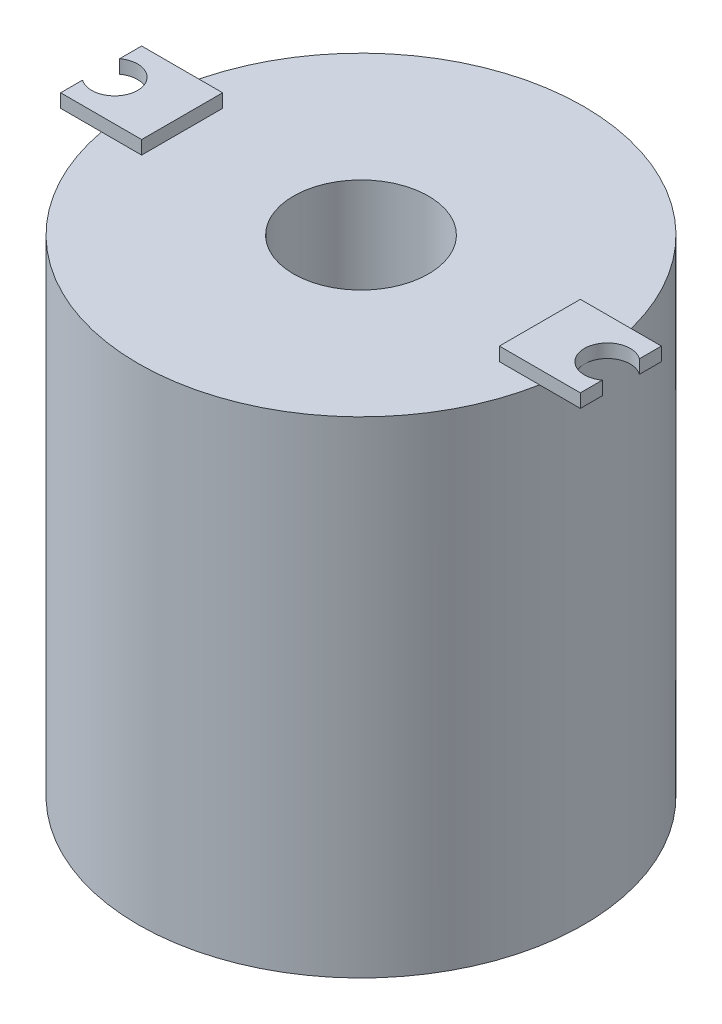
ISO-10303-21;
HEADER;
FILE_DESCRIPTION(('STEP AP214'),'2;1');
FILE_NAME('part.step','',(''),(''),'','','');
FILE_SCHEMA(('AUTOMOTIVE_DESIGN { 1 0 10303 214 1 1 1 1 }'));
ENDSEC;
DATA;
#1=APPLICATION_CONTEXT('core data for automotive mechanical design processes');
#2=APPLICATION_PROTOCOL_DEFINITION('international standard','automotive_design',2000,#1);
#3=PRODUCT_CONTEXT('',#1,'mechanical');
#4=PRODUCT('Part','Part','',(#3));
#5=PRODUCT_RELATED_PRODUCT_CATEGORY('part','',(#4));
#6=PRODUCT_DEFINITION_FORMATION('','',#4);
#7=PRODUCT_DEFINITION_CONTEXT('part definition',#1,'design');
#8=PRODUCT_DEFINITION('design','',#6,#7);
#9=PRODUCT_DEFINITION_SHAPE('','',#8);
#10=(LENGTH_UNIT() NAMED_UNIT(*) SI_UNIT(.MILLI.,.METRE.));
#11=(NAMED_UNIT(*) PLANE_ANGLE_UNIT() SI_UNIT($,.RADIAN.));
#12=(NAMED_UNIT(*) SI_UNIT($,.STERADIAN.) SOLID_ANGLE_UNIT());
#13=UNCERTAINTY_MEASURE_WITH_UNIT(LENGTH_MEASURE(1.E-05),#10,'distance_accuracy_value','');
#14=(GEOMETRIC_REPRESENTATION_CONTEXT(3) GLOBAL_UNCERTAINTY_ASSIGNED_CONTEXT((#13)) GLOBAL_UNIT_ASSIGNED_CONTEXT((#10,
#11,#12)) REPRESENTATION_CONTEXT('',''));
#15=CARTESIAN_POINT('',(0.,0.,0.));
#16=DIRECTION('',(0.,0.,1.));
#17=DIRECTION('',(1.,0.,0.));
#18=AXIS2_PLACEMENT_3D('',#15,#16,#17);
#19=CARTESIAN_POINT('',(-19.25,37.,-3.));
#20=DIRECTION('',(-1.,0.,0.));
#21=DIRECTION('',(0.,0.,1.));
#22=AXIS2_PLACEMENT_3D('',#19,#20,#21);
#23=PLANE('',#22);
#24=DIRECTION('',(0.,1.,0.));
#25=VECTOR('',#24,1.);
#26=CARTESIAN_POINT('',(-19.25,37.,1.37477270848675));
#27=LINE('',#26,#25);
#28=CARTESIAN_POINT('',(-19.25,36.,1.37477270848675));
#29=VERTEX_POINT('',#28);
#30=CARTESIAN_POINT('',(-19.25,37.,1.37477270848675));
#31=VERTEX_POINT('',#30);
#32=EDGE_CURVE('E135',#29,#31,#27,.T.);
#33=ORIENTED_EDGE('',*,*,#32,.F.);
#34=DIRECTION('',(0.,0.,-1.));
#35=VECTOR('',#34,1.);
#36=CARTESIAN_POINT('',(-19.25,36.,-3.));
#37=LINE('',#36,#35);
#38=CARTESIAN_POINT('',(-19.25,36.,3.));
#39=VERTEX_POINT('',#38);
#40=EDGE_CURVE('E143',#39,#29,#37,.T.);
#41=ORIENTED_EDGE('',*,*,#40,.F.);
#42=DIRECTION('',(0.,-1.,0.));
#43=VECTOR('',#42,1.);
#44=CARTESIAN_POINT('',(-19.25,37.,3.));
#45=LINE('',#44,#43);
#46=CARTESIAN_POINT('',(-19.25,37.,3.));
#47=VERTEX_POINT('',#46);
#48=EDGE_CURVE('E166',#47,#39,#45,.T.);
#49=ORIENTED_EDGE('',*,*,#48,.F.);
#50=DIRECTION('',(0.,0.,-1.));
#51=VECTOR('',#50,1.);
#52=CARTESIAN_POINT('',(-19.25,37.,-3.));
#53=LINE('',#52,#51);
#54=EDGE_CURVE('E145',#47,#31,#53,.T.);
#55=ORIENTED_EDGE('',*,*,#54,.T.);
#56=EDGE_LOOP('',(#33,#41,#49,#55));
#57=FACE_BOUND('',#56,.T.);
#58=ADVANCED_FACE('F35',(#57),#23,.T.);
#59=CARTESIAN_POINT('',(19.25,37.,-3.));
#60=DIRECTION('',(-1.,0.,0.));
#61=DIRECTION('',(0.,0.,1.));
#62=AXIS2_PLACEMENT_3D('',#59,#60,#61);
#63=PLANE('',#62);
#64=DIRECTION('',(0.,0.,-1.));
#65=VECTOR('',#64,1.);
#66=CARTESIAN_POINT('',(19.25,36.,-3.));
#67=LINE('',#66,#65);
#68=CARTESIAN_POINT('',(19.25,36.,3.));
#69=VERTEX_POINT('',#68);
#70=CARTESIAN_POINT('',(19.25,36.,1.37477270848675));
#71=VERTEX_POINT('',#70);
#72=EDGE_CURVE('E203',#69,#71,#67,.T.);
#73=ORIENTED_EDGE('',*,*,#72,.T.);
#74=DIRECTION('',(0.,1.,0.));
#75=VECTOR('',#74,1.);
#76=CARTESIAN_POINT('',(19.25,37.,1.37477270848675));
#77=LINE('',#76,#75);
#78=CARTESIAN_POINT('',(19.25,37.,1.37477270848675));
#79=VERTEX_POINT('',#78);
#80=EDGE_CURVE('E179',#71,#79,#77,.T.);
#81=ORIENTED_EDGE('',*,*,#80,.T.);
#82=DIRECTION('',(0.,0.,-1.));
#83=VECTOR('',#82,1.);
#84=CARTESIAN_POINT('',(19.25,37.,-3.));
#85=LINE('',#84,#83);
#86=CARTESIAN_POINT('',(19.25,37.,3.));
#87=VERTEX_POINT('',#86);
#88=EDGE_CURVE('E190',#87,#79,#85,.T.);
#89=ORIENTED_EDGE('',*,*,#88,.F.);
#90=DIRECTION('',(0.,-1.,0.));
#91=VECTOR('',#90,1.);
#92=CARTESIAN_POINT('',(19.25,37.,3.));
#93=LINE('',#92,#91);
#94=EDGE_CURVE('E214',#87,#69,#93,.T.);
#95=ORIENTED_EDGE('',*,*,#94,.T.);
#96=EDGE_LOOP('',(#73,#81,#89,#95));
#97=FACE_BOUND('',#96,.T.);
#98=ADVANCED_FACE('F303',(#97),#63,.F.);
#99=CARTESIAN_POINT('',(0.,36.,0.));
#100=DIRECTION('',(0.,1.,0.));
#101=DIRECTION('',(0.,0.,1.));
#102=AXIS2_PLACEMENT_3D('',#99,#100,#101);
#103=PLANE('',#102);
#104=DIRECTION('',(1.,0.,0.));
#105=VECTOR('',#104,1.);
#106=CARTESIAN_POINT('',(-13.25,36.,-3.));
#107=LINE('',#106,#105);
#108=CARTESIAN_POINT('',(-16.224980739588,36.,-3.));
#109=VERTEX_POINT('',#108);
#110=CARTESIAN_POINT('',(-13.25,36.,-3.));
#111=VERTEX_POINT('',#110);
#112=EDGE_CURVE('E57',#109,#111,#107,.T.);
#113=ORIENTED_EDGE('',*,*,#112,.T.);
#114=DIRECTION('',(0.,0.,1.));
#115=VECTOR('',#114,1.);
#116=CARTESIAN_POINT('',(-13.25,36.,-3.));
#117=LINE('',#116,#115);
#118=CARTESIAN_POINT('',(-13.25,36.,3.));
#119=VERTEX_POINT('',#118);
#120=EDGE_CURVE('E146',#111,#119,#117,.T.);
#121=ORIENTED_EDGE('',*,*,#120,.T.);
#122=DIRECTION('',(-1.,0.,0.));
#123=VECTOR('',#122,1.);
#124=CARTESIAN_POINT('',(-13.25,36.,3.));
#125=LINE('',#124,#123);
#126=CARTESIAN_POINT('',(-16.224980739588,36.,3.));
#127=VERTEX_POINT('',#126);
#128=EDGE_CURVE('E155',#119,#127,#125,.T.);
#129=ORIENTED_EDGE('',*,*,#128,.T.);
#130=CARTESIAN_POINT('',(0.,36.,0.));
#131=DIRECTION('',(0.,1.,0.));
#132=DIRECTION('',(0.,0.,1.));
#133=AXIS2_PLACEMENT_3D('',#130,#131,#132);
#134=CIRCLE('',#133,16.5);
#135=CARTESIAN_POINT('',(16.224980739588,36.,3.));
#136=VERTEX_POINT('',#135);
#137=EDGE_CURVE('E231',#127,#136,#134,.T.);
#138=ORIENTED_EDGE('',*,*,#137,.T.);
#139=DIRECTION('',(1.,0.,0.));
#140=VECTOR('',#139,1.);
#141=CARTESIAN_POINT('',(13.25,36.,3.));
#142=LINE('',#141,#140);
#143=CARTESIAN_POINT('',(13.25,36.,3.));
#144=VERTEX_POINT('',#143);
#145=EDGE_CURVE('E199',#144,#136,#142,.T.);
#146=ORIENTED_EDGE('',*,*,#145,.F.);
#147=DIRECTION('',(0.,0.,1.));
#148=VECTOR('',#147,1.);
#149=CARTESIAN_POINT('',(13.25,36.,-3.));
#150=LINE('',#149,#148);
#151=CARTESIAN_POINT('',(13.25,36.,-3.));
#152=VERTEX_POINT('',#151);
#153=EDGE_CURVE('E182',#152,#144,#150,.T.);
#154=ORIENTED_EDGE('',*,*,#153,.F.);
#155=DIRECTION('',(-1.,0.,0.));
#156=VECTOR('',#155,1.);
#157=CARTESIAN_POINT('',(13.25,36.,-3.));
#158=LINE('',#157,#156);
#159=CARTESIAN_POINT('',(16.224980739588,36.,-3.));
#160=VERTEX_POINT('',#159);
#161=EDGE_CURVE('E208',#160,#152,#158,.T.);
#162=ORIENTED_EDGE('',*,*,#161,.F.);
#163=EDGE_CURVE('E230',#160,#109,#134,.T.);
#164=ORIENTED_EDGE('',*,*,#163,.T.);
#165=EDGE_LOOP('',(#113,#121,#129,#138,#146,#154,#162,#164));
#166=FACE_BOUND('',#165,.T.);
#167=CARTESIAN_POINT('',(0.,36.,0.));
#168=DIRECTION('',(0.,1.,0.));
#169=DIRECTION('',(0.,0.,1.));
#170=AXIS2_PLACEMENT_3D('',#167,#168,#169);
#171=CIRCLE('',#170,5.);
#172=CARTESIAN_POINT('',(0.,36.,5.));
#173=VERTEX_POINT('',#172);
#174=EDGE_CURVE('E221',#173,#173,#171,.T.);
#175=ORIENTED_EDGE('',*,*,#174,.F.);
#176=EDGE_LOOP('',(#175));
#177=FACE_BOUND('',#176,.T.);
#178=ADVANCED_FACE('F262',(#166,#177),#103,.T.);
#179=CARTESIAN_POINT('',(0.,0.,0.));
#180=DIRECTION('',(0.,1.,0.));
#181=DIRECTION('',(0.,0.,1.));
#182=AXIS2_PLACEMENT_3D('',#179,#180,#181);
#183=PLANE('',#182);
#184=CARTESIAN_POINT('',(0.,0.,0.));
#185=DIRECTION('',(0.,1.,0.));
#186=DIRECTION('',(0.,0.,1.));
#187=AXIS2_PLACEMENT_3D('',#184,#185,#186);
#188=CIRCLE('',#187,16.5);
#189=CARTESIAN_POINT('',(0.,0.,16.5));
#190=VERTEX_POINT('',#189);
#191=EDGE_CURVE('E224',#190,#190,#188,.T.);
#192=ORIENTED_EDGE('',*,*,#191,.F.);
#193=EDGE_LOOP('',(#192));
#194=FACE_BOUND('',#193,.T.);
#195=CARTESIAN_POINT('',(0.,0.,0.));
#196=DIRECTION('',(0.,1.,0.));
#197=DIRECTION('',(0.,0.,1.));
#198=AXIS2_PLACEMENT_3D('',#195,#196,#197);
#199=CIRCLE('',#198,5.);
#200=CARTESIAN_POINT('',(0.,0.,5.));
#201=VERTEX_POINT('',#200);
#202=EDGE_CURVE('E220',#201,#201,#199,.T.);
#203=ORIENTED_EDGE('',*,*,#202,.T.);
#204=EDGE_LOOP('',(#203));
#205=FACE_BOUND('',#204,.T.);
#206=ADVANCED_FACE('F313',(#194,#205),#183,.F.);
#207=CARTESIAN_POINT('',(0.,36.,0.));
#208=DIRECTION('',(0.,-1.,0.));
#209=DIRECTION('',(0.,0.,-1.));
#210=AXIS2_PLACEMENT_3D('',#207,#208,#209);
#211=CYLINDRICAL_SURFACE('',#210,16.5);
#212=EDGE_CURVE('E227',#136,#160,#134,.T.);
#213=ORIENTED_EDGE('',*,*,#212,.F.);
#214=ORIENTED_EDGE('',*,*,#137,.F.);
#215=EDGE_CURVE('E260',#109,#127,#134,.T.);
#216=ORIENTED_EDGE('',*,*,#215,.F.);
#217=ORIENTED_EDGE('',*,*,#163,.F.);
#218=EDGE_LOOP('',(#213,#214,#216,#217));
#219=FACE_BOUND('',#218,.T.);
#220=ORIENTED_EDGE('',*,*,#191,.T.);
#221=EDGE_LOOP('',(#220));
#222=FACE_BOUND('',#221,.T.);
#223=ADVANCED_FACE('F37',(#219,#222),#211,.T.);
#224=CARTESIAN_POINT('',(0.,36.,0.));
#225=DIRECTION('',(0.,-1.,0.));
#226=DIRECTION('',(0.,0.,-1.));
#227=AXIS2_PLACEMENT_3D('',#224,#225,#226);
#228=CYLINDRICAL_SURFACE('',#227,5.);
#229=ORIENTED_EDGE('',*,*,#174,.T.);
#230=EDGE_LOOP('',(#229));
#231=FACE_BOUND('',#230,.T.);
#232=ORIENTED_EDGE('',*,*,#202,.F.);
#233=EDGE_LOOP('',(#232));
#234=FACE_BOUND('',#233,.T.);
#235=ADVANCED_FACE('F337',(#231,#234),#228,.F.);
#236=CARTESIAN_POINT('',(0.,36.,0.));
#237=DIRECTION('',(0.,1.,0.));
#238=DIRECTION('',(0.,0.,1.));
#239=AXIS2_PLACEMENT_3D('',#236,#237,#238);
#240=PLANE('',#239);
#241=CARTESIAN_POINT('',(19.25,36.,-1.37477270848675));
#242=VERTEX_POINT('',#241);
#243=CARTESIAN_POINT('',(19.25,36.,-3.));
#244=VERTEX_POINT('',#243);
#245=EDGE_CURVE('E202',#242,#244,#67,.T.);
#246=ORIENTED_EDGE('',*,*,#245,.F.);
#247=CARTESIAN_POINT('',(18.25,36.,0.));
#248=DIRECTION('',(0.,1.,0.));
#249=DIRECTION('',(0.,0.,1.));
#250=AXIS2_PLACEMENT_3D('',#247,#248,#249);
#251=CIRCLE('',#250,1.7);
#252=EDGE_CURVE('E43',#242,#71,#251,.T.);
#253=ORIENTED_EDGE('',*,*,#252,.T.);
#254=ORIENTED_EDGE('',*,*,#72,.F.);
#255=EDGE_CURVE('E198',#136,#69,#142,.T.);
#256=ORIENTED_EDGE('',*,*,#255,.F.);
#257=ORIENTED_EDGE('',*,*,#212,.T.);
#258=EDGE_CURVE('E187',#244,#160,#158,.T.);
#259=ORIENTED_EDGE('',*,*,#258,.F.);
#260=EDGE_LOOP('',(#246,#253,#254,#256,#257,#259));
#261=FACE_BOUND('',#260,.T.);
#262=ADVANCED_FACE('F255',(#261),#240,.F.);
#263=CARTESIAN_POINT('',(13.25,37.,-3.));
#264=DIRECTION('',(1.,0.,0.));
#265=DIRECTION('',(0.,0.,-1.));
#266=AXIS2_PLACEMENT_3D('',#263,#264,#265);
#267=PLANE('',#266);
#268=ORIENTED_EDGE('',*,*,#153,.T.);
#269=DIRECTION('',(0.,-1.,0.));
#270=VECTOR('',#269,1.);
#271=CARTESIAN_POINT('',(13.25,37.,3.));
#272=LINE('',#271,#270);
#273=CARTESIAN_POINT('',(13.25,37.,3.));
#274=VERTEX_POINT('',#273);
#275=EDGE_CURVE('E217',#274,#144,#272,.T.);
#276=ORIENTED_EDGE('',*,*,#275,.F.);
#277=DIRECTION('',(0.,0.,1.));
#278=VECTOR('',#277,1.);
#279=CARTESIAN_POINT('',(13.25,37.,-3.));
#280=LINE('',#279,#278);
#281=CARTESIAN_POINT('',(13.25,37.,-3.));
#282=VERTEX_POINT('',#281);
#283=EDGE_CURVE('E183',#282,#274,#280,.T.);
#284=ORIENTED_EDGE('',*,*,#283,.F.);
#285=DIRECTION('',(0.,-1.,0.));
#286=VECTOR('',#285,1.);
#287=CARTESIAN_POINT('',(13.25,37.,-3.));
#288=LINE('',#287,#286);
#289=EDGE_CURVE('E195',#282,#152,#288,.T.);
#290=ORIENTED_EDGE('',*,*,#289,.T.);
#291=EDGE_LOOP('',(#268,#276,#284,#290));
#292=FACE_BOUND('',#291,.T.);
#293=ADVANCED_FACE('F246',(#292),#267,.F.);
#294=CARTESIAN_POINT('',(13.25,37.,3.));
#295=DIRECTION('',(0.,0.,-1.));
#296=DIRECTION('',(-1.,0.,0.));
#297=AXIS2_PLACEMENT_3D('',#294,#295,#296);
#298=PLANE('',#297);
#299=ORIENTED_EDGE('',*,*,#145,.T.);
#300=ORIENTED_EDGE('',*,*,#255,.T.);
#301=ORIENTED_EDGE('',*,*,#94,.F.);
#302=DIRECTION('',(1.,0.,0.));
#303=VECTOR('',#302,1.);
#304=CARTESIAN_POINT('',(13.25,37.,3.));
#305=LINE('',#304,#303);
#306=EDGE_CURVE('E186',#274,#87,#305,.T.);
#307=ORIENTED_EDGE('',*,*,#306,.F.);
#308=ORIENTED_EDGE('',*,*,#275,.T.);
#309=EDGE_LOOP('',(#299,#300,#301,#307,#308));
#310=FACE_BOUND('',#309,.T.);
#311=ADVANCED_FACE('F318',(#310),#298,.F.);
#312=CARTESIAN_POINT('',(19.25,37.,-1.37477270848675));
#313=VERTEX_POINT('',#312);
#314=CARTESIAN_POINT('',(19.25,37.,-3.));
#315=VERTEX_POINT('',#314);
#316=EDGE_CURVE('E189',#313,#315,#85,.T.);
#317=ORIENTED_EDGE('',*,*,#316,.F.);
#318=DIRECTION('',(0.,1.,0.));
#319=VECTOR('',#318,1.);
#320=CARTESIAN_POINT('',(19.25,37.,-1.37477270848675));
#321=LINE('',#320,#319);
#322=EDGE_CURVE('E176',#313,#242,#321,.F.);
#323=ORIENTED_EDGE('',*,*,#322,.T.);
#324=ORIENTED_EDGE('',*,*,#245,.T.);
#325=DIRECTION('',(0.,-1.,0.));
#326=VECTOR('',#325,1.);
#327=CARTESIAN_POINT('',(19.25,37.,-3.));
#328=LINE('',#327,#326);
#329=EDGE_CURVE('E211',#315,#244,#328,.T.);
#330=ORIENTED_EDGE('',*,*,#329,.F.);
#331=EDGE_LOOP('',(#317,#323,#324,#330));
#332=FACE_BOUND('',#331,.T.);
#333=ADVANCED_FACE('F309',(#332),#63,.F.);
#334=CARTESIAN_POINT('',(13.25,37.,-3.));
#335=DIRECTION('',(0.,0.,1.));
#336=DIRECTION('',(1.,0.,0.));
#337=AXIS2_PLACEMENT_3D('',#334,#335,#336);
#338=PLANE('',#337);
#339=ORIENTED_EDGE('',*,*,#258,.T.);
#340=ORIENTED_EDGE('',*,*,#161,.T.);
#341=ORIENTED_EDGE('',*,*,#289,.F.);
#342=DIRECTION('',(-1.,0.,0.));
#343=VECTOR('',#342,1.);
#344=CARTESIAN_POINT('',(13.25,37.,-3.));
#345=LINE('',#344,#343);
#346=EDGE_CURVE('E193',#315,#282,#345,.T.);
#347=ORIENTED_EDGE('',*,*,#346,.F.);
#348=ORIENTED_EDGE('',*,*,#329,.T.);
#349=EDGE_LOOP('',(#339,#340,#341,#347,#348));
#350=FACE_BOUND('',#349,.T.);
#351=ADVANCED_FACE('F240',(#350),#338,.F.);
#352=CARTESIAN_POINT('',(0.,37.,0.));
#353=DIRECTION('',(0.,1.,0.));
#354=DIRECTION('',(0.,0.,1.));
#355=AXIS2_PLACEMENT_3D('',#352,#353,#354);
#356=PLANE('',#355);
#357=CARTESIAN_POINT('',(18.25,37.,0.));
#358=DIRECTION('',(0.,1.,0.));
#359=DIRECTION('',(0.,0.,1.));
#360=AXIS2_PLACEMENT_3D('',#357,#358,#359);
#361=CIRCLE('',#360,1.7);
#362=EDGE_CURVE('E174',#313,#79,#361,.T.);
#363=ORIENTED_EDGE('',*,*,#362,.F.);
#364=ORIENTED_EDGE('',*,*,#316,.T.);
#365=ORIENTED_EDGE('',*,*,#346,.T.);
#366=ORIENTED_EDGE('',*,*,#283,.T.);
#367=ORIENTED_EDGE('',*,*,#306,.T.);
#368=ORIENTED_EDGE('',*,*,#88,.T.);
#369=EDGE_LOOP('',(#363,#364,#365,#366,#367,#368));
#370=FACE_BOUND('',#369,.T.);
#371=ADVANCED_FACE('F250',(#370),#356,.T.);
#372=CARTESIAN_POINT('',(18.25,37.,0.));
#373=DIRECTION('',(0.,1.,0.));
#374=DIRECTION('',(0.,0.,1.));
#375=AXIS2_PLACEMENT_3D('',#372,#373,#374);
#376=CYLINDRICAL_SURFACE('',#375,1.7);
#377=ORIENTED_EDGE('',*,*,#252,.F.);
#378=ORIENTED_EDGE('',*,*,#322,.F.);
#379=ORIENTED_EDGE('',*,*,#362,.T.);
#380=ORIENTED_EDGE('',*,*,#80,.F.);
#381=EDGE_LOOP('',(#377,#378,#379,#380));
#382=FACE_BOUND('',#381,.T.);
#383=ADVANCED_FACE('F325',(#382),#376,.F.);
#384=CARTESIAN_POINT('',(-13.25,37.,-3.));
#385=DIRECTION('',(1.,0.,0.));
#386=DIRECTION('',(0.,0.,-1.));
#387=AXIS2_PLACEMENT_3D('',#384,#385,#386);
#388=PLANE('',#387);
#389=ORIENTED_EDGE('',*,*,#120,.F.);
#390=DIRECTION('',(0.,-1.,0.));
#391=VECTOR('',#390,1.);
#392=CARTESIAN_POINT('',(-13.25,37.,-3.));
#393=LINE('',#392,#391);
#394=CARTESIAN_POINT('',(-13.25,37.,-3.));
#395=VERTEX_POINT('',#394);
#396=EDGE_CURVE('E172',#395,#111,#393,.T.);
#397=ORIENTED_EDGE('',*,*,#396,.F.);
#398=DIRECTION('',(0.,0.,1.));
#399=VECTOR('',#398,1.);
#400=CARTESIAN_POINT('',(-13.25,37.,-3.));
#401=LINE('',#400,#399);
#402=CARTESIAN_POINT('',(-13.25,37.,3.));
#403=VERTEX_POINT('',#402);
#404=EDGE_CURVE('E162',#395,#403,#401,.T.);
#405=ORIENTED_EDGE('',*,*,#404,.T.);
#406=DIRECTION('',(0.,-1.,0.));
#407=VECTOR('',#406,1.);
#408=CARTESIAN_POINT('',(-13.25,37.,3.));
#409=LINE('',#408,#407);
#410=EDGE_CURVE('E163',#403,#119,#409,.T.);
#411=ORIENTED_EDGE('',*,*,#410,.T.);
#412=EDGE_LOOP('',(#389,#397,#405,#411));
#413=FACE_BOUND('',#412,.T.);
#414=ADVANCED_FACE('F289',(#413),#388,.T.);
#415=CARTESIAN_POINT('',(-13.25,37.,-3.));
#416=DIRECTION('',(0.,0.,-1.));
#417=DIRECTION('',(-1.,0.,0.));
#418=AXIS2_PLACEMENT_3D('',#415,#416,#417);
#419=PLANE('',#418);
#420=CARTESIAN_POINT('',(-19.25,36.,-3.));
#421=VERTEX_POINT('',#420);
#422=EDGE_CURVE('E157',#421,#109,#107,.T.);
#423=ORIENTED_EDGE('',*,*,#422,.F.);
#424=DIRECTION('',(0.,-1.,0.));
#425=VECTOR('',#424,1.);
#426=CARTESIAN_POINT('',(-19.25,37.,-3.));
#427=LINE('',#426,#425);
#428=CARTESIAN_POINT('',(-19.25,37.,-3.));
#429=VERTEX_POINT('',#428);
#430=EDGE_CURVE('E169',#429,#421,#427,.T.);
#431=ORIENTED_EDGE('',*,*,#430,.F.);
#432=DIRECTION('',(1.,0.,0.));
#433=VECTOR('',#432,1.);
#434=CARTESIAN_POINT('',(-13.25,37.,-3.));
#435=LINE('',#434,#433);
#436=EDGE_CURVE('E279',#429,#395,#435,.T.);
#437=ORIENTED_EDGE('',*,*,#436,.T.);
#438=ORIENTED_EDGE('',*,*,#396,.T.);
#439=ORIENTED_EDGE('',*,*,#112,.F.);
#440=EDGE_LOOP('',(#423,#431,#437,#438,#439));
#441=FACE_BOUND('',#440,.T.);
#442=ADVANCED_FACE('F285',(#441),#419,.T.);
#443=DIRECTION('',(0.,1.,0.));
#444=VECTOR('',#443,1.);
#445=CARTESIAN_POINT('',(-19.25,37.,-1.37477270848675));
#446=LINE('',#445,#444);
#447=CARTESIAN_POINT('',(-19.25,37.,-1.37477270848675));
#448=VERTEX_POINT('',#447);
#449=CARTESIAN_POINT('',(-19.25,36.,-1.37477270848675));
#450=VERTEX_POINT('',#449);
#451=EDGE_CURVE('E50',#448,#450,#446,.F.);
#452=ORIENTED_EDGE('',*,*,#451,.F.);
#453=EDGE_CURVE('E276',#448,#429,#53,.T.);
#454=ORIENTED_EDGE('',*,*,#453,.T.);
#455=ORIENTED_EDGE('',*,*,#430,.T.);
#456=EDGE_CURVE('E153',#450,#421,#37,.T.);
#457=ORIENTED_EDGE('',*,*,#456,.F.);
#458=EDGE_LOOP('',(#452,#454,#455,#457));
#459=FACE_BOUND('',#458,.T.);
#460=ADVANCED_FACE('F293',(#459),#23,.T.);
#461=CARTESIAN_POINT('',(-13.25,37.,3.));
#462=DIRECTION('',(0.,0.,1.));
#463=DIRECTION('',(1.,0.,0.));
#464=AXIS2_PLACEMENT_3D('',#461,#462,#463);
#465=PLANE('',#464);
#466=ORIENTED_EDGE('',*,*,#128,.F.);
#467=ORIENTED_EDGE('',*,*,#410,.F.);
#468=DIRECTION('',(-1.,0.,0.));
#469=VECTOR('',#468,1.);
#470=CARTESIAN_POINT('',(-13.25,37.,3.));
#471=LINE('',#470,#469);
#472=EDGE_CURVE('E167',#403,#47,#471,.T.);
#473=ORIENTED_EDGE('',*,*,#472,.T.);
#474=ORIENTED_EDGE('',*,*,#48,.T.);
#475=EDGE_CURVE('E151',#127,#39,#125,.T.);
#476=ORIENTED_EDGE('',*,*,#475,.F.);
#477=EDGE_LOOP('',(#466,#467,#473,#474,#476));
#478=FACE_BOUND('',#477,.T.);
#479=ADVANCED_FACE('F267',(#478),#465,.T.);
#480=CARTESIAN_POINT('',(0.,37.,0.));
#481=DIRECTION('',(0.,1.,0.));
#482=DIRECTION('',(0.,0.,1.));
#483=AXIS2_PLACEMENT_3D('',#480,#481,#482);
#484=PLANE('',#483);
#485=CARTESIAN_POINT('',(-18.25,37.,0.));
#486=DIRECTION('',(0.,1.,0.));
#487=DIRECTION('',(0.,0.,1.));
#488=AXIS2_PLACEMENT_3D('',#485,#486,#487);
#489=CIRCLE('',#488,1.7);
#490=EDGE_CURVE('E275',#31,#448,#489,.T.);
#491=ORIENTED_EDGE('',*,*,#490,.F.);
#492=ORIENTED_EDGE('',*,*,#54,.F.);
#493=ORIENTED_EDGE('',*,*,#472,.F.);
#494=ORIENTED_EDGE('',*,*,#404,.F.);
#495=ORIENTED_EDGE('',*,*,#436,.F.);
#496=ORIENTED_EDGE('',*,*,#453,.F.);
#497=EDGE_LOOP('',(#491,#492,#493,#494,#495,#496));
#498=FACE_BOUND('',#497,.T.);
#499=ADVANCED_FACE('F272',(#498),#484,.T.);
#500=CARTESIAN_POINT('',(0.,36.,0.));
#501=DIRECTION('',(0.,1.,0.));
#502=DIRECTION('',(0.,0.,1.));
#503=AXIS2_PLACEMENT_3D('',#500,#501,#502);
#504=PLANE('',#503);
#505=ORIENTED_EDGE('',*,*,#40,.T.);
#506=CARTESIAN_POINT('',(-18.25,36.,0.));
#507=DIRECTION('',(0.,1.,0.));
#508=DIRECTION('',(0.,0.,1.));
#509=AXIS2_PLACEMENT_3D('',#506,#507,#508);
#510=CIRCLE('',#509,1.7);
#511=EDGE_CURVE('E11',#29,#450,#510,.T.);
#512=ORIENTED_EDGE('',*,*,#511,.T.);
#513=ORIENTED_EDGE('',*,*,#456,.T.);
#514=ORIENTED_EDGE('',*,*,#422,.T.);
#515=ORIENTED_EDGE('',*,*,#215,.T.);
#516=ORIENTED_EDGE('',*,*,#475,.T.);
#517=EDGE_LOOP('',(#505,#512,#513,#514,#515,#516));
#518=FACE_BOUND('',#517,.T.);
#519=ADVANCED_FACE('F148',(#518),#504,.F.);
#520=CARTESIAN_POINT('',(-18.25,37.,0.));
#521=DIRECTION('',(0.,1.,0.));
#522=DIRECTION('',(0.,0.,1.));
#523=AXIS2_PLACEMENT_3D('',#520,#521,#522);
#524=CYLINDRICAL_SURFACE('',#523,1.7);
#525=ORIENTED_EDGE('',*,*,#32,.T.);
#526=ORIENTED_EDGE('',*,*,#490,.T.);
#527=ORIENTED_EDGE('',*,*,#451,.T.);
#528=ORIENTED_EDGE('',*,*,#511,.F.);
#529=EDGE_LOOP('',(#525,#526,#527,#528));
#530=FACE_BOUND('',#529,.T.);
#531=ADVANCED_FACE('F134',(#530),#524,.F.);
#532=CLOSED_SHELL('',(#58,#98,#178,#206,#223,#235,#262,#293,#311,#333,#351,#371,#383,#414,#442,
#460,#479,#499,#519,#531));
#533=MANIFOLD_SOLID_BREP('B2',#532);
#534=ADVANCED_BREP_SHAPE_REPRESENTATION('',(#18,#533),#14);
#535=SHAPE_DEFINITION_REPRESENTATION(#9,#534);
ENDSEC;
END-ISO-10303-21;
